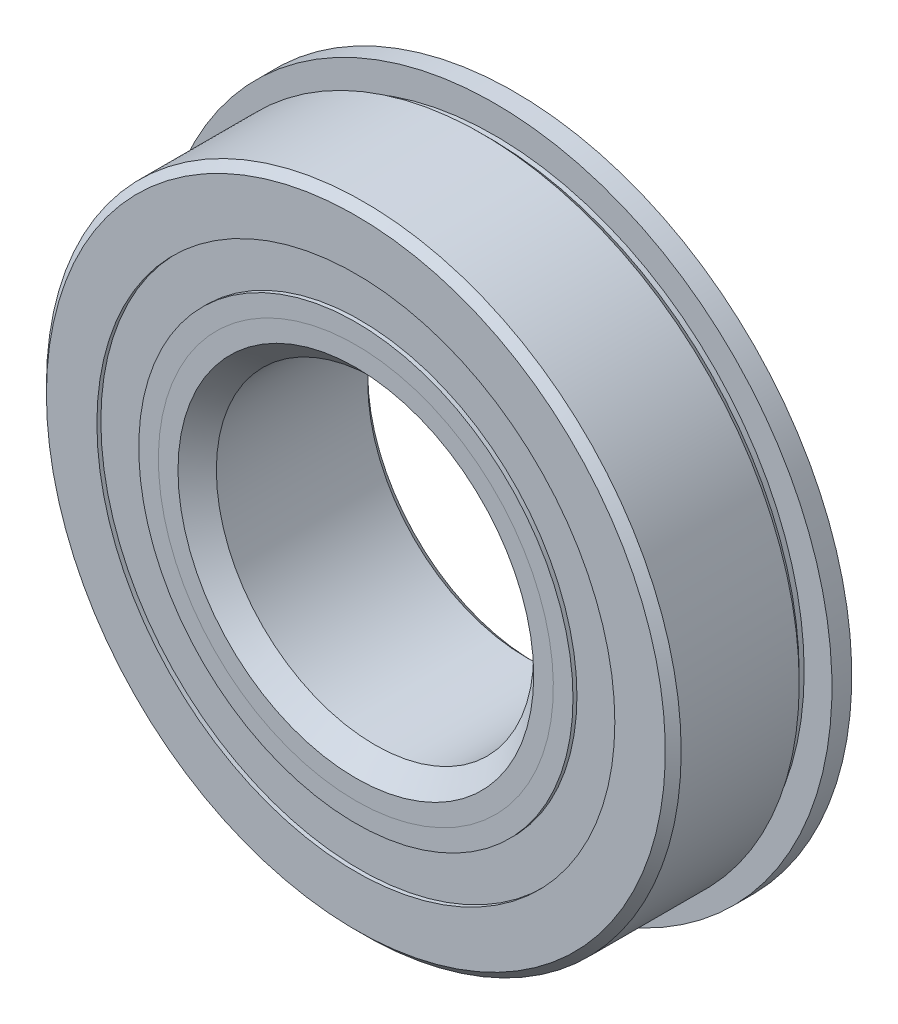
ISO-10303-21;
HEADER;
FILE_DESCRIPTION(('STEP AP214'),'2;1');
FILE_NAME('part.step','',(''),(''),'','','');
FILE_SCHEMA(('AUTOMOTIVE_DESIGN { 1 0 10303 214 1 1 1 1 }'));
ENDSEC;
DATA;
#1=APPLICATION_CONTEXT('core data for automotive mechanical design processes');
#2=APPLICATION_PROTOCOL_DEFINITION('international standard','automotive_design',2000,#1);
#3=PRODUCT_CONTEXT('',#1,'mechanical');
#4=PRODUCT('Part','Part','',(#3));
#5=PRODUCT_RELATED_PRODUCT_CATEGORY('part','',(#4));
#6=PRODUCT_DEFINITION_FORMATION('','',#4);
#7=PRODUCT_DEFINITION_CONTEXT('part definition',#1,'design');
#8=PRODUCT_DEFINITION('design','',#6,#7);
#9=PRODUCT_DEFINITION_SHAPE('','',#8);
#10=(LENGTH_UNIT() NAMED_UNIT(*) SI_UNIT(.MILLI.,.METRE.));
#11=(NAMED_UNIT(*) PLANE_ANGLE_UNIT() SI_UNIT($,.RADIAN.));
#12=(NAMED_UNIT(*) SI_UNIT($,.STERADIAN.) SOLID_ANGLE_UNIT());
#13=UNCERTAINTY_MEASURE_WITH_UNIT(LENGTH_MEASURE(1.E-05),#10,'distance_accuracy_value','');
#14=(GEOMETRIC_REPRESENTATION_CONTEXT(3) GLOBAL_UNCERTAINTY_ASSIGNED_CONTEXT((#13)) GLOBAL_UNIT_ASSIGNED_CONTEXT((#10,
#11,#12)) REPRESENTATION_CONTEXT('',''));
#15=CARTESIAN_POINT('',(0.,0.,0.));
#16=DIRECTION('',(0.,0.,1.));
#17=DIRECTION('',(1.,0.,0.));
#18=AXIS2_PLACEMENT_3D('',#15,#16,#17);
#19=CARTESIAN_POINT('',(14.8938897410159,-11.8774807254089,0.));
#20=DIRECTION('',(0.781831482468027,-0.623489801858737,0.));
#21=DIRECTION('',(0.,0.,1.));
#22=AXIS2_PLACEMENT_3D('',#19,#20,#21);
#23=SPHERICAL_SURFACE('',#22,3.28171342706955);
#24=CARTESIAN_POINT('',(17.4596366147369,-13.9235955798097,0.));
#25=VERTEX_POINT('',#24);
#26=VERTEX_LOOP('',#25);
#27=FACE_BOUND('',#26,.T.);
#28=ADVANCED_FACE('P0_F13',(#27),#23,.T.);
#29=CLOSED_SHELL('',(#28));
#30=MANIFOLD_SOLID_BREP('P0_B1',#29);
#31=CARTESIAN_POINT('',(-18.5723767270638,-4.23902379186761,0.));
#32=DIRECTION('',(-0.974927912181826,-0.222520933956306,0.));
#33=DIRECTION('',(0.,0.,-1.));
#34=AXIS2_PLACEMENT_3D('',#31,#32,#33);
#35=SPHERICAL_SURFACE('',#34,3.28171342706955);
#36=CARTESIAN_POINT('',(-21.7718107468958,-4.96927372863608,0.));
#37=VERTEX_POINT('',#36);
#38=VERTEX_LOOP('',#37);
#39=FACE_BOUND('',#38,.T.);
#40=ADVANCED_FACE('P1_F13',(#39),#35,.T.);
#41=CLOSED_SHELL('',(#40));
#42=MANIFOLD_SOLID_BREP('P1_B1',#41);
#43=CARTESIAN_POINT('',(0.,20.7247252747253,-6.0325));
#44=DIRECTION('',(0.,0.,1.));
#45=DIRECTION('',(1.,0.,0.));
#46=AXIS2_PLACEMENT_3D('',#43,#44,#45);
#47=PLANE('',#46);
#48=CARTESIAN_POINT('',(0.,0.,-6.0325));
#49=DIRECTION('',(0.,0.,1.));
#50=DIRECTION('',(1.,0.,0.));
#51=AXIS2_PLACEMENT_3D('',#48,#49,#50);
#52=CIRCLE('',#51,20.7247252747253);
#53=CARTESIAN_POINT('',(20.7247252747253,0.,-6.0325));
#54=VERTEX_POINT('',#53);
#55=EDGE_CURVE('P2_E18',#54,#54,#52,.T.);
#56=ORIENTED_EDGE('',*,*,#55,.F.);
#57=EDGE_LOOP('',(#56));
#58=FACE_BOUND('',#57,.T.);
#59=CARTESIAN_POINT('',(0.,0.,-6.0325));
#60=DIRECTION('',(0.,0.,1.));
#61=DIRECTION('',(1.,0.,0.));
#62=AXIS2_PLACEMENT_3D('',#59,#60,#61);
#63=CIRCLE('',#62,17.3752747252747);
#64=CARTESIAN_POINT('',(17.3752747252747,0.,-6.0325));
#65=VERTEX_POINT('',#64);
#66=EDGE_CURVE('P2_E27',#65,#65,#63,.T.);
#67=ORIENTED_EDGE('',*,*,#66,.T.);
#68=EDGE_LOOP('',(#67));
#69=FACE_BOUND('',#68,.T.);
#70=ADVANCED_FACE('P2_F15',(#58,#69),#47,.F.);
#71=CARTESIAN_POINT('',(0.,0.,6.35));
#72=DIRECTION('',(0.,0.,1.));
#73=DIRECTION('',(1.,0.,0.));
#74=AXIS2_PLACEMENT_3D('',#71,#72,#73);
#75=CYLINDRICAL_SURFACE('',#74,20.7247252747253);
#76=ORIENTED_EDGE('',*,*,#55,.T.);
#77=EDGE_LOOP('',(#76));
#78=FACE_BOUND('',#77,.T.);
#79=CARTESIAN_POINT('',(0.,0.,-3.28171342706955));
#80=DIRECTION('',(0.,0.,1.));
#81=DIRECTION('',(1.,0.,0.));
#82=AXIS2_PLACEMENT_3D('',#79,#80,#81);
#83=CIRCLE('',#82,20.7247252747253);
#84=CARTESIAN_POINT('',(20.7247252747253,0.,-3.28171342706955));
#85=VERTEX_POINT('',#84);
#86=EDGE_CURVE('P2_E22',#85,#85,#83,.F.);
#87=ORIENTED_EDGE('',*,*,#86,.T.);
#88=EDGE_LOOP('',(#87));
#89=FACE_BOUND('',#88,.T.);
#90=ADVANCED_FACE('P2_F35',(#78,#89),#75,.T.);
#91=CARTESIAN_POINT('',(0.,0.,6.35));
#92=DIRECTION('',(0.,0.,1.));
#93=DIRECTION('',(1.,0.,0.));
#94=AXIS2_PLACEMENT_3D('',#91,#92,#93);
#95=CYLINDRICAL_SURFACE('',#94,17.3752747252747);
#96=ORIENTED_EDGE('',*,*,#66,.F.);
#97=EDGE_LOOP('',(#96));
#98=FACE_BOUND('',#97,.T.);
#99=CARTESIAN_POINT('',(0.,0.,-3.28171342706955));
#100=DIRECTION('',(0.,0.,1.));
#101=DIRECTION('',(1.,0.,0.));
#102=AXIS2_PLACEMENT_3D('',#99,#100,#101);
#103=CIRCLE('',#102,17.3752747252747);
#104=CARTESIAN_POINT('',(17.3752747252747,0.,-3.28171342706955));
#105=VERTEX_POINT('',#104);
#106=EDGE_CURVE('P2_E10',#105,#105,#103,.T.);
#107=ORIENTED_EDGE('',*,*,#106,.T.);
#108=EDGE_LOOP('',(#107));
#109=FACE_BOUND('',#108,.T.);
#110=ADVANCED_FACE('P2_F43',(#98,#109),#95,.F.);
#111=CARTESIAN_POINT('',(0.,20.7247252747253,-3.28171342706955));
#112=DIRECTION('',(0.,0.,-1.));
#113=DIRECTION('',(-1.,0.,0.));
#114=AXIS2_PLACEMENT_3D('',#111,#112,#113);
#115=PLANE('',#114);
#116=ORIENTED_EDGE('',*,*,#106,.F.);
#117=EDGE_LOOP('',(#116));
#118=FACE_BOUND('',#117,.T.);
#119=ORIENTED_EDGE('',*,*,#86,.F.);
#120=EDGE_LOOP('',(#119));
#121=FACE_BOUND('',#120,.T.);
#122=ADVANCED_FACE('P2_F44',(#118,#121),#115,.F.);
#123=CLOSED_SHELL('',(#70,#90,#110,#122));
#124=MANIFOLD_SOLID_BREP('P2_B1',#123);
#125=CARTESIAN_POINT('',(0.,0.,6.35));
#126=DIRECTION('',(0.,0.,1.));
#127=DIRECTION('',(1.,0.,0.));
#128=AXIS2_PLACEMENT_3D('',#125,#126,#127);
#129=CYLINDRICAL_SURFACE('',#128,17.3752747252747);
#130=CARTESIAN_POINT('',(0.,0.,6.35));
#131=DIRECTION('',(0.,0.,1.));
#132=DIRECTION('',(1.,0.,0.));
#133=AXIS2_PLACEMENT_3D('',#130,#131,#132);
#134=CIRCLE('',#133,17.3752747252747);
#135=CARTESIAN_POINT('',(17.3752747252747,0.,6.35));
#136=VERTEX_POINT('',#135);
#137=EDGE_CURVE('P3_E19',#136,#136,#134,.F.);
#138=ORIENTED_EDGE('',*,*,#137,.T.);
#139=EDGE_LOOP('',(#138));
#140=FACE_BOUND('',#139,.T.);
#141=CARTESIAN_POINT('',(0.,0.,2.82222222222222));
#142=DIRECTION('',(0.,0.,1.));
#143=DIRECTION('',(1.,0.,0.));
#144=AXIS2_PLACEMENT_3D('',#141,#142,#143);
#145=CIRCLE('',#144,17.3752747252747);
#146=CARTESIAN_POINT('',(17.3752747252747,0.,2.82222222222222));
#147=VERTEX_POINT('',#146);
#148=EDGE_CURVE('P3_E32',#147,#147,#145,.T.);
#149=ORIENTED_EDGE('',*,*,#148,.T.);
#150=EDGE_LOOP('',(#149));
#151=FACE_BOUND('',#150,.T.);
#152=ADVANCED_FACE('P3_F15',(#140,#151),#129,.T.);
#153=CARTESIAN_POINT('',(0.,17.3752747252747,6.35));
#154=DIRECTION('',(0.,0.,-1.));
#155=DIRECTION('',(-1.,0.,0.));
#156=AXIS2_PLACEMENT_3D('',#153,#154,#155);
#157=PLANE('',#156);
#158=CARTESIAN_POINT('',(0.,0.,6.35));
#159=DIRECTION('',(0.,0.,1.));
#160=DIRECTION('',(0.,-1.,0.));
#161=AXIS2_PLACEMENT_3D('',#158,#159,#160);
#162=CIRCLE('',#161,15.80470900587);
#163=CARTESIAN_POINT('',(0.,-15.80470900587,6.35));
#164=VERTEX_POINT('',#163);
#165=EDGE_CURVE('P3_E34',#164,#164,#162,.F.);
#166=ORIENTED_EDGE('',*,*,#165,.T.);
#167=EDGE_LOOP('',(#166));
#168=FACE_BOUND('',#167,.T.);
#169=ORIENTED_EDGE('',*,*,#137,.F.);
#170=EDGE_LOOP('',(#169));
#171=FACE_BOUND('',#170,.T.);
#172=ADVANCED_FACE('P3_F45',(#168,#171),#157,.F.);
#173=CARTESIAN_POINT('',(0.,0.,0.));
#174=DIRECTION('',(0.,0.,1.));
#175=DIRECTION('',(1.,0.,0.));
#176=AXIS2_PLACEMENT_3D('',#173,#174,#175);
#177=TOROIDAL_SURFACE('',#176,19.05,3.28171342706955);
#178=ORIENTED_EDGE('',*,*,#148,.F.);
#179=EDGE_LOOP('',(#178));
#180=FACE_BOUND('',#179,.T.);
#181=CARTESIAN_POINT('',(0.,0.,0.));
#182=DIRECTION('',(0.,0.,1.));
#183=DIRECTION('',(1.,0.,0.));
#184=AXIS2_PLACEMENT_3D('',#181,#182,#183);
#185=CIRCLE('',#184,15.7682865729304);
#186=CARTESIAN_POINT('',(15.7682865729304,0.,0.));
#187=VERTEX_POINT('',#186);
#188=EDGE_CURVE('P3_E28',#187,#187,#185,.T.);
#189=ORIENTED_EDGE('',*,*,#188,.T.);
#190=EDGE_LOOP('',(#189));
#191=FACE_BOUND('',#190,.T.);
#192=ADVANCED_FACE('P3_F17',(#180,#191),#177,.F.);
#193=CARTESIAN_POINT('',(0.,0.,6.35));
#194=DIRECTION('',(0.,0.,1.));
#195=DIRECTION('',(0.,-1.,0.));
#196=AXIS2_PLACEMENT_3D('',#193,#194,#195);
#197=CONICAL_SURFACE('',#196,15.80470900587,0.78539816339745);
#198=ORIENTED_EDGE('',*,*,#165,.F.);
#199=EDGE_LOOP('',(#198));
#200=FACE_BOUND('',#199,.T.);
#201=CARTESIAN_POINT('',(0.,0.,4.77943428059526));
#202=DIRECTION('',(0.,0.,1.));
#203=DIRECTION('',(1.,0.,0.));
#204=AXIS2_PLACEMENT_3D('',#201,#202,#203);
#205=CIRCLE('',#204,14.2341432864652);
#206=CARTESIAN_POINT('',(14.2341432864652,0.,4.77943428059526));
#207=VERTEX_POINT('',#206);
#208=EDGE_CURVE('P3_E23',#207,#207,#205,.F.);
#209=ORIENTED_EDGE('',*,*,#208,.T.);
#210=EDGE_LOOP('',(#209));
#211=FACE_BOUND('',#210,.T.);
#212=ADVANCED_FACE('P3_F53',(#200,#211),#197,.F.);
#213=CARTESIAN_POINT('',(0.,14.2341432864652,0.));
#214=DIRECTION('',(0.,0.,1.));
#215=DIRECTION('',(1.,0.,0.));
#216=AXIS2_PLACEMENT_3D('',#213,#214,#215);
#217=PLANE('',#216);
#218=ORIENTED_EDGE('',*,*,#188,.F.);
#219=EDGE_LOOP('',(#218));
#220=FACE_BOUND('',#219,.T.);
#221=CARTESIAN_POINT('',(0.,0.,0.));
#222=DIRECTION('',(0.,0.,1.));
#223=DIRECTION('',(1.,0.,0.));
#224=AXIS2_PLACEMENT_3D('',#221,#222,#223);
#225=CIRCLE('',#224,14.2341432864652);
#226=CARTESIAN_POINT('',(14.2341432864652,0.,0.));
#227=VERTEX_POINT('',#226);
#228=EDGE_CURVE('P3_E10',#227,#227,#225,.T.);
#229=ORIENTED_EDGE('',*,*,#228,.T.);
#230=EDGE_LOOP('',(#229));
#231=FACE_BOUND('',#230,.T.);
#232=ADVANCED_FACE('P3_F58',(#220,#231),#217,.F.);
#233=CARTESIAN_POINT('',(0.,0.,6.35));
#234=DIRECTION('',(0.,0.,1.));
#235=DIRECTION('',(1.,0.,0.));
#236=AXIS2_PLACEMENT_3D('',#233,#234,#235);
#237=CYLINDRICAL_SURFACE('',#236,14.2341432864652);
#238=ORIENTED_EDGE('',*,*,#208,.F.);
#239=EDGE_LOOP('',(#238));
#240=FACE_BOUND('',#239,.T.);
#241=ORIENTED_EDGE('',*,*,#228,.F.);
#242=EDGE_LOOP('',(#241));
#243=FACE_BOUND('',#242,.T.);
#244=ADVANCED_FACE('P3_F56',(#240,#243),#237,.F.);
#245=CLOSED_SHELL('',(#152,#172,#192,#212,#232,#244));
#246=MANIFOLD_SOLID_BREP('P3_B1',#245);
#247=CARTESIAN_POINT('',(0.,19.05,0.));
#248=DIRECTION('',(0.,1.,0.));
#249=DIRECTION('',(0.,0.,1.));
#250=AXIS2_PLACEMENT_3D('',#247,#248,#249);
#251=SPHERICAL_SURFACE('',#250,3.28171342706955);
#252=CARTESIAN_POINT('',(0.,22.3317134270696,0.));
#253=VERTEX_POINT('',#252);
#254=VERTEX_LOOP('',#253);
#255=FACE_BOUND('',#254,.T.);
#256=ADVANCED_FACE('P4_F13',(#255),#251,.T.);
#257=CLOSED_SHELL('',(#256));
#258=MANIFOLD_SOLID_BREP('P4_B1',#257);
#259=CARTESIAN_POINT('',(-8.26548523018962,-17.163456933541,0.));
#260=DIRECTION('',(-0.433883739117566,-0.900968867902416,0.));
#261=DIRECTION('',(0.,0.,-1.));
#262=AXIS2_PLACEMENT_3D('',#259,#260,#261);
#263=SPHERICAL_SURFACE('',#262,3.28171342706955);
#264=CARTESIAN_POINT('',(-9.68936732263887,-20.120178564708,0.));
#265=VERTEX_POINT('',#264);
#266=VERTEX_LOOP('',#265);
#267=FACE_BOUND('',#266,.T.);
#268=ADVANCED_FACE('P5_F13',(#267),#263,.T.);
#269=CLOSED_SHELL('',(#268));
#270=MANIFOLD_SOLID_BREP('P5_B1',#269);
#271=CARTESIAN_POINT('',(-18.5723767270637,4.23902379186798,0.));
#272=DIRECTION('',(-0.974927912181821,0.222520933956325,0.));
#273=DIRECTION('',(0.,0.,1.));
#274=AXIS2_PLACEMENT_3D('',#271,#272,#273);
#275=SPHERICAL_SURFACE('',#274,3.28171342706955);
#276=CARTESIAN_POINT('',(-21.7718107468957,4.96927372863651,0.));
#277=VERTEX_POINT('',#276);
#278=VERTEX_LOOP('',#277);
#279=FACE_BOUND('',#278,.T.);
#280=ADVANCED_FACE('P6_F13',(#279),#275,.T.);
#281=CLOSED_SHELL('',(#280));
#282=MANIFOLD_SOLID_BREP('P6_B1',#281);
#283=CARTESIAN_POINT('',(-14.8938897410158,11.8774807254091,0.));
#284=DIRECTION('',(-0.781831482468022,0.623489801858743,0.));
#285=DIRECTION('',(0.,0.,-1.));
#286=AXIS2_PLACEMENT_3D('',#283,#284,#285);
#287=SPHERICAL_SURFACE('',#286,3.28171342706955);
#288=CARTESIAN_POINT('',(-17.4596366147368,13.9235955798098,0.));
#289=VERTEX_POINT('',#288);
#290=VERTEX_LOOP('',#289);
#291=FACE_BOUND('',#290,.T.);
#292=ADVANCED_FACE('P7_F13',(#291),#287,.T.);
#293=CLOSED_SHELL('',(#292));
#294=MANIFOLD_SOLID_BREP('P7_B1',#293);
#295=CARTESIAN_POINT('',(0.,14.2341432864652,0.));
#296=DIRECTION('',(0.,0.,-1.));
#297=DIRECTION('',(-1.,0.,0.));
#298=AXIS2_PLACEMENT_3D('',#295,#296,#297);
#299=PLANE('',#298);
#300=CARTESIAN_POINT('',(0.,0.,0.));
#301=DIRECTION('',(0.,0.,1.));
#302=DIRECTION('',(1.,0.,0.));
#303=AXIS2_PLACEMENT_3D('',#300,#301,#302);
#304=CIRCLE('',#303,14.2341432864652);
#305=CARTESIAN_POINT('',(14.2341432864652,0.,0.));
#306=VERTEX_POINT('',#305);
#307=EDGE_CURVE('P8_E19',#306,#306,#304,.T.);
#308=ORIENTED_EDGE('',*,*,#307,.F.);
#309=EDGE_LOOP('',(#308));
#310=FACE_BOUND('',#309,.T.);
#311=CARTESIAN_POINT('',(0.,0.,0.));
#312=DIRECTION('',(0.,0.,1.));
#313=DIRECTION('',(0.,-1.,0.));
#314=AXIS2_PLACEMENT_3D('',#311,#312,#313);
#315=CIRCLE('',#314,15.7682865729304);
#316=CARTESIAN_POINT('',(0.,-15.7682865729304,0.));
#317=VERTEX_POINT('',#316);
#318=EDGE_CURVE('P8_E40',#317,#317,#315,.T.);
#319=ORIENTED_EDGE('',*,*,#318,.T.);
#320=EDGE_LOOP('',(#319));
#321=FACE_BOUND('',#320,.T.);
#322=ADVANCED_FACE('P8_F15',(#310,#321),#299,.F.);
#323=CARTESIAN_POINT('',(0.,0.,6.35));
#324=DIRECTION('',(0.,0.,1.));
#325=DIRECTION('',(1.,0.,0.));
#326=AXIS2_PLACEMENT_3D('',#323,#324,#325);
#327=CYLINDRICAL_SURFACE('',#326,14.2341432864652);
#328=ORIENTED_EDGE('',*,*,#307,.T.);
#329=EDGE_LOOP('',(#328));
#330=FACE_BOUND('',#329,.T.);
#331=CARTESIAN_POINT('',(0.,0.,4.77943428059526));
#332=DIRECTION('',(0.,0.,1.));
#333=DIRECTION('',(1.,0.,0.));
#334=AXIS2_PLACEMENT_3D('',#331,#332,#333);
#335=CIRCLE('',#334,14.2341432864652);
#336=CARTESIAN_POINT('',(14.2341432864652,0.,4.77943428059526));
#337=VERTEX_POINT('',#336);
#338=EDGE_CURVE('P8_E37',#337,#337,#335,.T.);
#339=ORIENTED_EDGE('',*,*,#338,.F.);
#340=EDGE_LOOP('',(#339));
#341=FACE_BOUND('',#340,.T.);
#342=ADVANCED_FACE('P8_F56',(#330,#341),#327,.T.);
#343=CARTESIAN_POINT('',(0.,0.,0.));
#344=DIRECTION('',(0.,0.,1.));
#345=DIRECTION('',(0.,-1.,0.));
#346=AXIS2_PLACEMENT_3D('',#343,#344,#345);
#347=TOROIDAL_SURFACE('',#346,19.05,3.28171342706955);
#348=ORIENTED_EDGE('',*,*,#318,.F.);
#349=EDGE_LOOP('',(#348));
#350=FACE_BOUND('',#349,.T.);
#351=CARTESIAN_POINT('',(0.,0.,-2.82222222222222));
#352=DIRECTION('',(0.,0.,1.));
#353=DIRECTION('',(1.,0.,0.));
#354=AXIS2_PLACEMENT_3D('',#351,#352,#353);
#355=CIRCLE('',#354,17.3752747252747);
#356=CARTESIAN_POINT('',(17.3752747252747,0.,-2.82222222222222));
#357=VERTEX_POINT('',#356);
#358=EDGE_CURVE('P8_E33',#357,#357,#355,.F.);
#359=ORIENTED_EDGE('',*,*,#358,.F.);
#360=EDGE_LOOP('',(#359));
#361=FACE_BOUND('',#360,.T.);
#362=ADVANCED_FACE('P8_F17',(#350,#361),#347,.F.);
#363=CARTESIAN_POINT('',(0.,0.,6.35));
#364=DIRECTION('',(0.,0.,1.));
#365=DIRECTION('',(0.,-1.,0.));
#366=AXIS2_PLACEMENT_3D('',#363,#364,#365);
#367=CONICAL_SURFACE('',#366,15.80470900587,0.78539816339745);
#368=ORIENTED_EDGE('',*,*,#338,.T.);
#369=EDGE_LOOP('',(#368));
#370=FACE_BOUND('',#369,.T.);
#371=CARTESIAN_POINT('',(0.,0.,6.35));
#372=DIRECTION('',(0.,0.,1.));
#373=DIRECTION('',(0.,-1.,0.));
#374=AXIS2_PLACEMENT_3D('',#371,#372,#373);
#375=CIRCLE('',#374,15.80470900587);
#376=CARTESIAN_POINT('',(0.,-15.80470900587,6.35));
#377=VERTEX_POINT('',#376);
#378=EDGE_CURVE('P8_E36',#377,#377,#375,.F.);
#379=ORIENTED_EDGE('',*,*,#378,.T.);
#380=EDGE_LOOP('',(#379));
#381=FACE_BOUND('',#380,.T.);
#382=ADVANCED_FACE('P8_F92',(#370,#381),#367,.T.);
#383=CARTESIAN_POINT('',(0.,0.,6.35));
#384=DIRECTION('',(0.,0.,1.));
#385=DIRECTION('',(1.,0.,0.));
#386=AXIS2_PLACEMENT_3D('',#383,#384,#385);
#387=CYLINDRICAL_SURFACE('',#386,17.3752747252747);
#388=ORIENTED_EDGE('',*,*,#358,.T.);
#389=EDGE_LOOP('',(#388));
#390=FACE_BOUND('',#389,.T.);
#391=CARTESIAN_POINT('',(0.,0.,-7.9375));
#392=DIRECTION('',(0.,0.,1.));
#393=DIRECTION('',(1.,0.,0.));
#394=AXIS2_PLACEMENT_3D('',#391,#392,#393);
#395=CIRCLE('',#394,17.3752747252747);
#396=CARTESIAN_POINT('',(17.3752747252747,0.,-7.9375));
#397=VERTEX_POINT('',#396);
#398=EDGE_CURVE('P8_E46',#397,#397,#395,.T.);
#399=ORIENTED_EDGE('',*,*,#398,.T.);
#400=EDGE_LOOP('',(#399));
#401=FACE_BOUND('',#400,.T.);
#402=ADVANCED_FACE('P8_F88',(#390,#401),#387,.T.);
#403=CARTESIAN_POINT('',(0.,15.80470900587,6.35));
#404=DIRECTION('',(0.,0.,-1.));
#405=DIRECTION('',(-1.,0.,0.));
#406=AXIS2_PLACEMENT_3D('',#403,#404,#405);
#407=PLANE('',#406);
#408=CARTESIAN_POINT('',(0.,0.,6.35));
#409=DIRECTION('',(0.,0.,1.));
#410=DIRECTION('',(1.,0.,0.));
#411=AXIS2_PLACEMENT_3D('',#408,#409,#410);
#412=CIRCLE('',#411,14.2341432864652);
#413=CARTESIAN_POINT('',(14.2341432864652,0.,6.35));
#414=VERTEX_POINT('',#413);
#415=EDGE_CURVE('P8_E43',#414,#414,#412,.F.);
#416=ORIENTED_EDGE('',*,*,#415,.T.);
#417=EDGE_LOOP('',(#416));
#418=FACE_BOUND('',#417,.T.);
#419=ORIENTED_EDGE('',*,*,#378,.F.);
#420=EDGE_LOOP('',(#419));
#421=FACE_BOUND('',#420,.T.);
#422=ADVANCED_FACE('P8_F84',(#418,#421),#407,.F.);
#423=CARTESIAN_POINT('',(0.,13.335,-7.9375));
#424=DIRECTION('',(0.,0.,1.));
#425=DIRECTION('',(1.,0.,0.));
#426=AXIS2_PLACEMENT_3D('',#423,#424,#425);
#427=PLANE('',#426);
#428=ORIENTED_EDGE('',*,*,#398,.F.);
#429=EDGE_LOOP('',(#428));
#430=FACE_BOUND('',#429,.T.);
#431=CARTESIAN_POINT('',(0.,0.,-7.9375));
#432=DIRECTION('',(0.,0.,-1.));
#433=DIRECTION('',(-1.,0.,0.));
#434=AXIS2_PLACEMENT_3D('',#431,#432,#433);
#435=CIRCLE('',#434,13.335);
#436=CARTESIAN_POINT('',(-13.335,0.,-7.9375));
#437=VERTEX_POINT('',#436);
#438=EDGE_CURVE('P8_E28',#437,#437,#435,.F.);
#439=ORIENTED_EDGE('',*,*,#438,.T.);
#440=EDGE_LOOP('',(#439));
#441=FACE_BOUND('',#440,.T.);
#442=ADVANCED_FACE('P8_F80',(#430,#441),#427,.F.);
#443=CARTESIAN_POINT('',(0.,0.,6.35));
#444=DIRECTION('',(0.,0.,1.));
#445=DIRECTION('',(1.,0.,0.));
#446=AXIS2_PLACEMENT_3D('',#443,#444,#445);
#447=CONICAL_SURFACE('',#446,14.2341432864652,0.785398163397448);
#448=ORIENTED_EDGE('',*,*,#415,.F.);
#449=EDGE_LOOP('',(#448));
#450=FACE_BOUND('',#449,.T.);
#451=CARTESIAN_POINT('',(0.,0.,4.81585671353478));
#452=DIRECTION('',(0.,0.,1.));
#453=DIRECTION('',(1.,0.,0.));
#454=AXIS2_PLACEMENT_3D('',#451,#452,#453);
#455=CIRCLE('',#454,12.7);
#456=CARTESIAN_POINT('',(12.7,0.,4.81585671353478));
#457=VERTEX_POINT('',#456);
#458=EDGE_CURVE('P8_E23',#457,#457,#455,.F.);
#459=ORIENTED_EDGE('',*,*,#458,.T.);
#460=EDGE_LOOP('',(#459));
#461=FACE_BOUND('',#460,.T.);
#462=ADVANCED_FACE('P8_F73',(#450,#461),#447,.F.);
#463=CARTESIAN_POINT('',(0.,0.,-7.9375));
#464=DIRECTION('',(0.,0.,-1.));
#465=DIRECTION('',(-1.,0.,0.));
#466=AXIS2_PLACEMENT_3D('',#463,#464,#465);
#467=CONICAL_SURFACE('',#466,13.335,0.785398163397448);
#468=CARTESIAN_POINT('',(0.,0.,-7.3025));
#469=DIRECTION('',(0.,0.,1.));
#470=DIRECTION('',(1.,0.,0.));
#471=AXIS2_PLACEMENT_3D('',#468,#469,#470);
#472=CIRCLE('',#471,12.7);
#473=CARTESIAN_POINT('',(12.7,0.,-7.3025));
#474=VERTEX_POINT('',#473);
#475=EDGE_CURVE('P8_E10',#474,#474,#472,.T.);
#476=ORIENTED_EDGE('',*,*,#475,.T.);
#477=EDGE_LOOP('',(#476));
#478=FACE_BOUND('',#477,.T.);
#479=ORIENTED_EDGE('',*,*,#438,.F.);
#480=EDGE_LOOP('',(#479));
#481=FACE_BOUND('',#480,.T.);
#482=ADVANCED_FACE('P8_F67',(#478,#481),#467,.F.);
#483=CARTESIAN_POINT('',(0.,0.,6.35));
#484=DIRECTION('',(0.,0.,1.));
#485=DIRECTION('',(1.,0.,0.));
#486=AXIS2_PLACEMENT_3D('',#483,#484,#485);
#487=CYLINDRICAL_SURFACE('',#486,12.7);
#488=ORIENTED_EDGE('',*,*,#458,.F.);
#489=EDGE_LOOP('',(#488));
#490=FACE_BOUND('',#489,.T.);
#491=ORIENTED_EDGE('',*,*,#475,.F.);
#492=EDGE_LOOP('',(#491));
#493=FACE_BOUND('',#492,.T.);
#494=ADVANCED_FACE('P8_F65',(#490,#493),#487,.F.);
#495=CLOSED_SHELL('',(#322,#342,#362,#382,#402,#422,#442,#462,#482,#494));
#496=MANIFOLD_SOLID_BREP('P8_B1',#495);
#497=CARTESIAN_POINT('',(-1.33025516058267E-13,-19.05,0.));
#498=DIRECTION('',(0.,-1.,0.));
#499=DIRECTION('',(0.,0.,-1.));
#500=AXIS2_PLACEMENT_3D('',#497,#498,#499);
#501=SPHERICAL_SURFACE('',#500,3.28171342706955);
#502=CARTESIAN_POINT('',(-1.55576921245966E-13,-22.3317134270696,0.));
#503=VERTEX_POINT('',#502);
#504=VERTEX_LOOP('',#503);
#505=FACE_BOUND('',#504,.T.);
#506=ADVANCED_FACE('P9_F13',(#505),#501,.T.);
#507=CLOSED_SHELL('',(#506));
#508=MANIFOLD_SOLID_BREP('P9_B1',#507);
#509=CARTESIAN_POINT('',(14.893889741016,11.8774807254088,0.));
#510=DIRECTION('',(0.781831482468031,0.623489801858732,0.));
#511=DIRECTION('',(0.,0.,-1.));
#512=AXIS2_PLACEMENT_3D('',#509,#510,#511);
#513=SPHERICAL_SURFACE('',#512,3.28171342706955);
#514=CARTESIAN_POINT('',(17.459636614737,13.9235955798096,0.));
#515=VERTEX_POINT('',#514);
#516=VERTEX_LOOP('',#515);
#517=FACE_BOUND('',#516,.T.);
#518=ADVANCED_FACE('P10_F13',(#517),#513,.T.);
#519=CLOSED_SHELL('',(#518));
#520=MANIFOLD_SOLID_BREP('P10_B1',#519);
#521=CARTESIAN_POINT('',(8.26548523018938,-17.1634569335411,0.));
#522=DIRECTION('',(0.433883739117553,-0.900968867902422,0.));
#523=DIRECTION('',(0.,0.,1.));
#524=AXIS2_PLACEMENT_3D('',#521,#522,#523);
#525=SPHERICAL_SURFACE('',#524,3.28171342706955);
#526=CARTESIAN_POINT('',(9.68936732263859,-20.1201785647082,0.));
#527=VERTEX_POINT('',#526);
#528=VERTEX_LOOP('',#527);
#529=FACE_BOUND('',#528,.T.);
#530=ADVANCED_FACE('P11_F13',(#529),#525,.T.);
#531=CLOSED_SHELL('',(#530));
#532=MANIFOLD_SOLID_BREP('P11_B1',#531);
#533=CARTESIAN_POINT('',(18.5723767270638,4.23902379186773,0.));
#534=DIRECTION('',(0.974927912181824,0.222520933956311,0.));
#535=DIRECTION('',(0.,0.,1.));
#536=AXIS2_PLACEMENT_3D('',#533,#534,#535);
#537=SPHERICAL_SURFACE('',#536,3.28171342706955);
#538=CARTESIAN_POINT('',(21.7718107468957,4.96927372863622,0.));
#539=VERTEX_POINT('',#538);
#540=VERTEX_LOOP('',#539);
#541=FACE_BOUND('',#540,.T.);
#542=ADVANCED_FACE('P12_F13',(#541),#537,.T.);
#543=CLOSED_SHELL('',(#542));
#544=MANIFOLD_SOLID_BREP('P12_B1',#543);
#545=CARTESIAN_POINT('',(-14.8938897410161,-11.8774807254087,0.));
#546=DIRECTION('',(-0.781831482468036,-0.623489801858726,0.));
#547=DIRECTION('',(0.,0.,-1.));
#548=AXIS2_PLACEMENT_3D('',#545,#546,#547);
#549=SPHERICAL_SURFACE('',#548,3.28171342706955);
#550=CARTESIAN_POINT('',(-17.4596366147371,-13.9235955798095,0.));
#551=VERTEX_POINT('',#550);
#552=VERTEX_LOOP('',#551);
#553=FACE_BOUND('',#552,.T.);
#554=ADVANCED_FACE('P13_F13',(#553),#549,.T.);
#555=CLOSED_SHELL('',(#554));
#556=MANIFOLD_SOLID_BREP('P13_B1',#555);
#557=CARTESIAN_POINT('',(0.,20.7247252747253,3.28171342706955));
#558=DIRECTION('',(0.,0.,1.));
#559=DIRECTION('',(1.,0.,0.));
#560=AXIS2_PLACEMENT_3D('',#557,#558,#559);
#561=PLANE('',#560);
#562=CARTESIAN_POINT('',(0.,0.,3.28171342706955));
#563=DIRECTION('',(0.,0.,1.));
#564=DIRECTION('',(1.,0.,0.));
#565=AXIS2_PLACEMENT_3D('',#562,#563,#564);
#566=CIRCLE('',#565,20.7247252747253);
#567=CARTESIAN_POINT('',(20.7247252747253,0.,3.28171342706955));
#568=VERTEX_POINT('',#567);
#569=EDGE_CURVE('P14_E18',#568,#568,#566,.T.);
#570=ORIENTED_EDGE('',*,*,#569,.F.);
#571=EDGE_LOOP('',(#570));
#572=FACE_BOUND('',#571,.T.);
#573=CARTESIAN_POINT('',(0.,0.,3.28171342706955));
#574=DIRECTION('',(0.,0.,1.));
#575=DIRECTION('',(1.,0.,0.));
#576=AXIS2_PLACEMENT_3D('',#573,#574,#575);
#577=CIRCLE('',#576,17.3752747252747);
#578=CARTESIAN_POINT('',(17.3752747252747,0.,3.28171342706955));
#579=VERTEX_POINT('',#578);
#580=EDGE_CURVE('P14_E27',#579,#579,#577,.T.);
#581=ORIENTED_EDGE('',*,*,#580,.T.);
#582=EDGE_LOOP('',(#581));
#583=FACE_BOUND('',#582,.T.);
#584=ADVANCED_FACE('P14_F15',(#572,#583),#561,.F.);
#585=CARTESIAN_POINT('',(0.,0.,6.35));
#586=DIRECTION('',(0.,0.,1.));
#587=DIRECTION('',(1.,0.,0.));
#588=AXIS2_PLACEMENT_3D('',#585,#586,#587);
#589=CYLINDRICAL_SURFACE('',#588,20.7247252747253);
#590=ORIENTED_EDGE('',*,*,#569,.T.);
#591=EDGE_LOOP('',(#590));
#592=FACE_BOUND('',#591,.T.);
#593=CARTESIAN_POINT('',(0.,0.,6.0325));
#594=DIRECTION('',(0.,0.,1.));
#595=DIRECTION('',(1.,0.,0.));
#596=AXIS2_PLACEMENT_3D('',#593,#594,#595);
#597=CIRCLE('',#596,20.7247252747253);
#598=CARTESIAN_POINT('',(20.7247252747253,0.,6.0325));
#599=VERTEX_POINT('',#598);
#600=EDGE_CURVE('P14_E22',#599,#599,#597,.F.);
#601=ORIENTED_EDGE('',*,*,#600,.T.);
#602=EDGE_LOOP('',(#601));
#603=FACE_BOUND('',#602,.T.);
#604=ADVANCED_FACE('P14_F35',(#592,#603),#589,.T.);
#605=CARTESIAN_POINT('',(0.,0.,6.35));
#606=DIRECTION('',(0.,0.,1.));
#607=DIRECTION('',(1.,0.,0.));
#608=AXIS2_PLACEMENT_3D('',#605,#606,#607);
#609=CYLINDRICAL_SURFACE('',#608,17.3752747252747);
#610=ORIENTED_EDGE('',*,*,#580,.F.);
#611=EDGE_LOOP('',(#610));
#612=FACE_BOUND('',#611,.T.);
#613=CARTESIAN_POINT('',(0.,0.,6.0325));
#614=DIRECTION('',(0.,0.,1.));
#615=DIRECTION('',(1.,0.,0.));
#616=AXIS2_PLACEMENT_3D('',#613,#614,#615);
#617=CIRCLE('',#616,17.3752747252747);
#618=CARTESIAN_POINT('',(17.3752747252747,0.,6.0325));
#619=VERTEX_POINT('',#618);
#620=EDGE_CURVE('P14_E10',#619,#619,#617,.T.);
#621=ORIENTED_EDGE('',*,*,#620,.T.);
#622=EDGE_LOOP('',(#621));
#623=FACE_BOUND('',#622,.T.);
#624=ADVANCED_FACE('P14_F43',(#612,#623),#609,.F.);
#625=CARTESIAN_POINT('',(0.,20.7247252747253,6.0325));
#626=DIRECTION('',(0.,0.,-1.));
#627=DIRECTION('',(-1.,0.,0.));
#628=AXIS2_PLACEMENT_3D('',#625,#626,#627);
#629=PLANE('',#628);
#630=ORIENTED_EDGE('',*,*,#620,.F.);
#631=EDGE_LOOP('',(#630));
#632=FACE_BOUND('',#631,.T.);
#633=ORIENTED_EDGE('',*,*,#600,.F.);
#634=EDGE_LOOP('',(#633));
#635=FACE_BOUND('',#634,.T.);
#636=ADVANCED_FACE('P14_F44',(#632,#635),#629,.F.);
#637=CLOSED_SHELL('',(#584,#604,#624,#636));
#638=MANIFOLD_SOLID_BREP('P14_B1',#637);
#639=CARTESIAN_POINT('',(-8.26548523018926,17.1634569335412,0.));
#640=DIRECTION('',(-0.433883739117546,0.900968867902425,0.));
#641=DIRECTION('',(0.,0.,-1.));
#642=AXIS2_PLACEMENT_3D('',#639,#640,#641);
#643=SPHERICAL_SURFACE('',#642,3.28171342706955);
#644=CARTESIAN_POINT('',(-9.68936732263845,20.1201785647082,0.));
#645=VERTEX_POINT('',#644);
#646=VERTEX_LOOP('',#645);
#647=FACE_BOUND('',#646,.T.);
#648=ADVANCED_FACE('P15_F13',(#647),#643,.T.);
#649=CLOSED_SHELL('',(#648));
#650=MANIFOLD_SOLID_BREP('P15_B1',#649);
#651=CARTESIAN_POINT('',(0.,0.,5.715));
#652=DIRECTION('',(0.,0.,-1.));
#653=DIRECTION('',(-1.,0.,0.));
#654=AXIS2_PLACEMENT_3D('',#651,#652,#653);
#655=CONICAL_SURFACE('',#654,25.4,0.785398163397445);
#656=CARTESIAN_POINT('',(0.,0.,5.715));
#657=DIRECTION('',(0.,0.,1.));
#658=DIRECTION('',(1.,0.,0.));
#659=AXIS2_PLACEMENT_3D('',#656,#657,#658);
#660=CIRCLE('',#659,25.4);
#661=CARTESIAN_POINT('',(25.4,0.,5.715));
#662=VERTEX_POINT('',#661);
#663=EDGE_CURVE('P16_E31',#662,#662,#660,.F.);
#664=ORIENTED_EDGE('',*,*,#663,.F.);
#665=EDGE_LOOP('',(#664));
#666=FACE_BOUND('',#665,.T.);
#667=CARTESIAN_POINT('',(0.,0.,6.35));
#668=DIRECTION('',(0.,0.,-1.));
#669=DIRECTION('',(-1.,0.,0.));
#670=AXIS2_PLACEMENT_3D('',#667,#668,#669);
#671=CIRCLE('',#670,24.765);
#672=CARTESIAN_POINT('',(-24.765,0.,6.35));
#673=VERTEX_POINT('',#672);
#674=EDGE_CURVE('P16_E19',#673,#673,#671,.T.);
#675=ORIENTED_EDGE('',*,*,#674,.T.);
#676=EDGE_LOOP('',(#675));
#677=FACE_BOUND('',#676,.T.);
#678=ADVANCED_FACE('P16_F15',(#666,#677),#655,.T.);
#679=CARTESIAN_POINT('',(0.,0.,6.35));
#680=DIRECTION('',(0.,0.,1.));
#681=DIRECTION('',(1.,0.,0.));
#682=AXIS2_PLACEMENT_3D('',#679,#680,#681);
#683=CYLINDRICAL_SURFACE('',#682,25.4);
#684=ORIENTED_EDGE('',*,*,#663,.T.);
#685=EDGE_LOOP('',(#684));
#686=FACE_BOUND('',#685,.T.);
#687=CARTESIAN_POINT('',(0.,0.,-3.730625));
#688=DIRECTION('',(0.,0.,1.));
#689=DIRECTION('',(1.,0.,0.));
#690=AXIS2_PLACEMENT_3D('',#687,#688,#689);
#691=CIRCLE('',#690,25.4);
#692=CARTESIAN_POINT('',(25.4,0.,-3.730625));
#693=VERTEX_POINT('',#692);
#694=EDGE_CURVE('P16_E43',#693,#693,#691,.F.);
#695=ORIENTED_EDGE('',*,*,#694,.F.);
#696=EDGE_LOOP('',(#695));
#697=FACE_BOUND('',#696,.T.);
#698=ADVANCED_FACE('P16_F92',(#686,#697),#683,.T.);
#699=CARTESIAN_POINT('',(0.,24.765,6.35));
#700=DIRECTION('',(0.,0.,-1.));
#701=DIRECTION('',(-1.,0.,0.));
#702=AXIS2_PLACEMENT_3D('',#699,#700,#701);
#703=PLANE('',#702);
#704=CARTESIAN_POINT('',(0.,0.,6.35));
#705=DIRECTION('',(0.,0.,1.));
#706=DIRECTION('',(1.,0.,0.));
#707=AXIS2_PLACEMENT_3D('',#704,#705,#706);
#708=CIRCLE('',#707,20.7247252747253);
#709=CARTESIAN_POINT('',(20.7247252747253,0.,6.35));
#710=VERTEX_POINT('',#709);
#711=EDGE_CURVE('P16_E40',#710,#710,#708,.F.);
#712=ORIENTED_EDGE('',*,*,#711,.T.);
#713=EDGE_LOOP('',(#712));
#714=FACE_BOUND('',#713,.T.);
#715=ORIENTED_EDGE('',*,*,#674,.F.);
#716=EDGE_LOOP('',(#715));
#717=FACE_BOUND('',#716,.T.);
#718=ADVANCED_FACE('P16_F89',(#714,#717),#703,.F.);
#719=CARTESIAN_POINT('',(0.,0.,-3.730625));
#720=DIRECTION('',(0.,0.,1.));
#721=DIRECTION('',(0.,-1.,0.));
#722=AXIS2_PLACEMENT_3D('',#719,#720,#721);
#723=CONICAL_SURFACE('',#722,25.4,0.785398163397444);
#724=ORIENTED_EDGE('',*,*,#694,.T.);
#725=EDGE_LOOP('',(#724));
#726=FACE_BOUND('',#725,.T.);
#727=CARTESIAN_POINT('',(0.,0.,-4.365625));
#728=DIRECTION('',(0.,0.,1.));
#729=DIRECTION('',(1.,0.,0.));
#730=AXIS2_PLACEMENT_3D('',#727,#728,#729);
#731=CIRCLE('',#730,24.765);
#732=CARTESIAN_POINT('',(24.765,0.,-4.365625));
#733=VERTEX_POINT('',#732);
#734=EDGE_CURVE('P16_E42',#733,#733,#731,.F.);
#735=ORIENTED_EDGE('',*,*,#734,.F.);
#736=EDGE_LOOP('',(#735));
#737=FACE_BOUND('',#736,.T.);
#738=ADVANCED_FACE('P16_F85',(#726,#737),#723,.T.);
#739=CARTESIAN_POINT('',(0.,0.,6.35));
#740=DIRECTION('',(0.,0.,1.));
#741=DIRECTION('',(1.,0.,0.));
#742=AXIS2_PLACEMENT_3D('',#739,#740,#741);
#743=CYLINDRICAL_SURFACE('',#742,20.7247252747253);
#744=ORIENTED_EDGE('',*,*,#711,.F.);
#745=EDGE_LOOP('',(#744));
#746=FACE_BOUND('',#745,.T.);
#747=CARTESIAN_POINT('',(0.,0.,2.82222222222222));
#748=DIRECTION('',(0.,0.,-1.));
#749=DIRECTION('',(-1.,0.,0.));
#750=AXIS2_PLACEMENT_3D('',#747,#748,#749);
#751=CIRCLE('',#750,20.7247252747253);
#752=CARTESIAN_POINT('',(-20.7247252747253,0.,2.82222222222222));
#753=VERTEX_POINT('',#752);
#754=EDGE_CURVE('P16_E39',#753,#753,#751,.T.);
#755=ORIENTED_EDGE('',*,*,#754,.T.);
#756=EDGE_LOOP('',(#755));
#757=FACE_BOUND('',#756,.T.);
#758=ADVANCED_FACE('P16_F81',(#746,#757),#743,.F.);
#759=CARTESIAN_POINT('',(0.,0.,6.35));
#760=DIRECTION('',(0.,0.,1.));
#761=DIRECTION('',(1.,0.,0.));
#762=AXIS2_PLACEMENT_3D('',#759,#760,#761);
#763=CYLINDRICAL_SURFACE('',#762,24.765);
#764=ORIENTED_EDGE('',*,*,#734,.T.);
#765=EDGE_LOOP('',(#764));
#766=FACE_BOUND('',#765,.T.);
#767=CARTESIAN_POINT('',(0.,0.,-4.7625));
#768=DIRECTION('',(0.,0.,1.));
#769=DIRECTION('',(1.,0.,0.));
#770=AXIS2_PLACEMENT_3D('',#767,#768,#769);
#771=CIRCLE('',#770,24.765);
#772=CARTESIAN_POINT('',(24.765,0.,-4.7625));
#773=VERTEX_POINT('',#772);
#774=EDGE_CURVE('P16_E37',#773,#773,#771,.F.);
#775=ORIENTED_EDGE('',*,*,#774,.F.);
#776=EDGE_LOOP('',(#775));
#777=FACE_BOUND('',#776,.T.);
#778=ADVANCED_FACE('P16_F77',(#766,#777),#763,.T.);
#779=CARTESIAN_POINT('',(0.,22.7448626373626,-4.7625));
#780=DIRECTION('',(0.,0.,1.));
#781=DIRECTION('',(1.,0.,0.));
#782=AXIS2_PLACEMENT_3D('',#779,#780,#781);
#783=PLANE('',#782);
#784=CARTESIAN_POINT('',(0.,0.,-4.7625));
#785=DIRECTION('',(0.,0.,-1.));
#786=DIRECTION('',(-1.,0.,0.));
#787=AXIS2_PLACEMENT_3D('',#784,#785,#786);
#788=CIRCLE('',#787,26.9875);
#789=CARTESIAN_POINT('',(-26.9875,0.,-4.7625));
#790=VERTEX_POINT('',#789);
#791=EDGE_CURVE('P16_E34',#790,#790,#788,.T.);
#792=ORIENTED_EDGE('',*,*,#791,.F.);
#793=EDGE_LOOP('',(#792));
#794=FACE_BOUND('',#793,.T.);
#795=ORIENTED_EDGE('',*,*,#774,.T.);
#796=EDGE_LOOP('',(#795));
#797=FACE_BOUND('',#796,.T.);
#798=ADVANCED_FACE('P16_F74',(#794,#797),#783,.T.);
#799=CARTESIAN_POINT('',(0.,0.,0.));
#800=DIRECTION('',(0.,0.,1.));
#801=DIRECTION('',(1.,0.,0.));
#802=AXIS2_PLACEMENT_3D('',#799,#800,#801);
#803=TOROIDAL_SURFACE('',#802,19.05,3.28171342706955);
#804=ORIENTED_EDGE('',*,*,#754,.F.);
#805=EDGE_LOOP('',(#804));
#806=FACE_BOUND('',#805,.T.);
#807=CARTESIAN_POINT('',(0.,0.,-2.82222222222222));
#808=DIRECTION('',(0.,0.,1.));
#809=DIRECTION('',(1.,0.,0.));
#810=AXIS2_PLACEMENT_3D('',#807,#808,#809);
#811=CIRCLE('',#810,20.7247252747253);
#812=CARTESIAN_POINT('',(20.7247252747253,0.,-2.82222222222222));
#813=VERTEX_POINT('',#812);
#814=EDGE_CURVE('P16_E28',#813,#813,#811,.F.);
#815=ORIENTED_EDGE('',*,*,#814,.T.);
#816=EDGE_LOOP('',(#815));
#817=FACE_BOUND('',#816,.T.);
#818=ADVANCED_FACE('P16_F17',(#806,#817),#803,.F.);
#819=CARTESIAN_POINT('',(0.,0.,-7.9375));
#820=DIRECTION('',(0.,0.,-1.));
#821=DIRECTION('',(-1.,0.,0.));
#822=AXIS2_PLACEMENT_3D('',#819,#820,#821);
#823=CYLINDRICAL_SURFACE('',#822,26.9875);
#824=ORIENTED_EDGE('',*,*,#791,.T.);
#825=EDGE_LOOP('',(#824));
#826=FACE_BOUND('',#825,.T.);
#827=CARTESIAN_POINT('',(0.,0.,-6.35));
#828=DIRECTION('',(0.,0.,-1.));
#829=DIRECTION('',(-1.,0.,0.));
#830=AXIS2_PLACEMENT_3D('',#827,#828,#829);
#831=CIRCLE('',#830,26.9875);
#832=CARTESIAN_POINT('',(-26.9875,0.,-6.35));
#833=VERTEX_POINT('',#832);
#834=EDGE_CURVE('P16_E23',#833,#833,#831,.F.);
#835=ORIENTED_EDGE('',*,*,#834,.T.);
#836=EDGE_LOOP('',(#835));
#837=FACE_BOUND('',#836,.T.);
#838=ADVANCED_FACE('P16_F62',(#826,#837),#823,.T.);
#839=CARTESIAN_POINT('',(0.,0.,6.35));
#840=DIRECTION('',(0.,0.,1.));
#841=DIRECTION('',(1.,0.,0.));
#842=AXIS2_PLACEMENT_3D('',#839,#840,#841);
#843=CYLINDRICAL_SURFACE('',#842,20.7247252747253);
#844=ORIENTED_EDGE('',*,*,#814,.F.);
#845=EDGE_LOOP('',(#844));
#846=FACE_BOUND('',#845,.T.);
#847=CARTESIAN_POINT('',(0.,0.,-6.35));
#848=DIRECTION('',(0.,0.,1.));
#849=DIRECTION('',(1.,0.,0.));
#850=AXIS2_PLACEMENT_3D('',#847,#848,#849);
#851=CIRCLE('',#850,20.7247252747253);
#852=CARTESIAN_POINT('',(20.7247252747253,0.,-6.35));
#853=VERTEX_POINT('',#852);
#854=EDGE_CURVE('P16_E10',#853,#853,#851,.F.);
#855=ORIENTED_EDGE('',*,*,#854,.T.);
#856=EDGE_LOOP('',(#855));
#857=FACE_BOUND('',#856,.T.);
#858=ADVANCED_FACE('P16_F59',(#846,#857),#843,.F.);
#859=CARTESIAN_POINT('',(0.,24.765,-6.35));
#860=DIRECTION('',(0.,0.,1.));
#861=DIRECTION('',(1.,0.,0.));
#862=AXIS2_PLACEMENT_3D('',#859,#860,#861);
#863=PLANE('',#862);
#864=ORIENTED_EDGE('',*,*,#854,.F.);
#865=EDGE_LOOP('',(#864));
#866=FACE_BOUND('',#865,.T.);
#867=ORIENTED_EDGE('',*,*,#834,.F.);
#868=EDGE_LOOP('',(#867));
#869=FACE_BOUND('',#868,.T.);
#870=ADVANCED_FACE('P16_F61',(#866,#869),#863,.F.);
#871=CLOSED_SHELL('',(#678,#698,#718,#738,#758,#778,#798,#818,#838,#858,#870));
#872=MANIFOLD_SOLID_BREP('P16_B1',#871);
#873=CARTESIAN_POINT('',(8.2654852301895,17.1634569335411,0.));
#874=DIRECTION('',(0.43388373911756,0.900968867902418,0.));
#875=DIRECTION('',(0.,0.,-1.));
#876=AXIS2_PLACEMENT_3D('',#873,#874,#875);
#877=SPHERICAL_SURFACE('',#876,3.28171342706955);
#878=CARTESIAN_POINT('',(9.68936732263874,20.1201785647081,0.));
#879=VERTEX_POINT('',#878);
#880=VERTEX_LOOP('',#879);
#881=FACE_BOUND('',#880,.T.);
#882=ADVANCED_FACE('P17_F13',(#881),#877,.T.);
#883=CLOSED_SHELL('',(#882));
#884=MANIFOLD_SOLID_BREP('P17_B1',#883);
#885=CARTESIAN_POINT('',(18.5723767270637,-4.23902379186786,0.));
#886=DIRECTION('',(0.974927912181823,-0.222520933956318,0.));
#887=DIRECTION('',(0.,0.,1.));
#888=AXIS2_PLACEMENT_3D('',#885,#886,#887);
#889=SPHERICAL_SURFACE('',#888,3.28171342706955);
#890=CARTESIAN_POINT('',(21.7718107468957,-4.96927372863637,0.));
#891=VERTEX_POINT('',#890);
#892=VERTEX_LOOP('',#891);
#893=FACE_BOUND('',#892,.T.);
#894=ADVANCED_FACE('P18_F13',(#893),#889,.T.);
#895=CLOSED_SHELL('',(#894));
#896=MANIFOLD_SOLID_BREP('P18_B1',#895);
#897=ADVANCED_BREP_SHAPE_REPRESENTATION('',(#18,#30,#42,#124,#246,#258,#270,#282,#294,#496,#508,
#520,#532,#544,#556,#638,#650,#872,#884,#896),#14);
#898=SHAPE_DEFINITION_REPRESENTATION(#9,#897);
ENDSEC;
END-ISO-10303-21;
